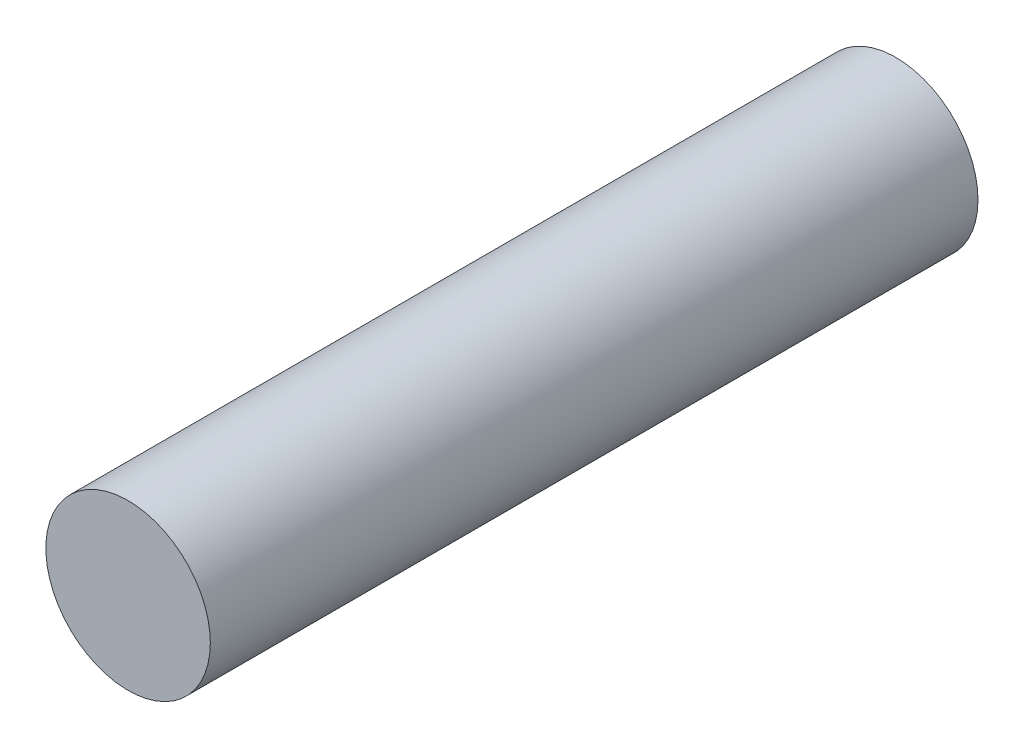
ISO-10303-21;
HEADER;
FILE_DESCRIPTION(('STEP AP214'),'2;1');
FILE_NAME('part.step','',(''),(''),'','','');
FILE_SCHEMA(('AUTOMOTIVE_DESIGN { 1 0 10303 214 1 1 1 1 }'));
ENDSEC;
DATA;
#1=APPLICATION_CONTEXT('core data for automotive mechanical design processes');
#2=APPLICATION_PROTOCOL_DEFINITION('international standard','automotive_design',2000,#1);
#3=PRODUCT_CONTEXT('',#1,'mechanical');
#4=PRODUCT('Part','Part','',(#3));
#5=PRODUCT_RELATED_PRODUCT_CATEGORY('part','',(#4));
#6=PRODUCT_DEFINITION_FORMATION('','',#4);
#7=PRODUCT_DEFINITION_CONTEXT('part definition',#1,'design');
#8=PRODUCT_DEFINITION('design','',#6,#7);
#9=PRODUCT_DEFINITION_SHAPE('','',#8);
#10=(LENGTH_UNIT() NAMED_UNIT(*) SI_UNIT(.MILLI.,.METRE.));
#11=(NAMED_UNIT(*) PLANE_ANGLE_UNIT() SI_UNIT($,.RADIAN.));
#12=(NAMED_UNIT(*) SI_UNIT($,.STERADIAN.) SOLID_ANGLE_UNIT());
#13=UNCERTAINTY_MEASURE_WITH_UNIT(LENGTH_MEASURE(1.E-05),#10,'distance_accuracy_value','');
#14=(GEOMETRIC_REPRESENTATION_CONTEXT(3) GLOBAL_UNCERTAINTY_ASSIGNED_CONTEXT((#13)) GLOBAL_UNIT_ASSIGNED_CONTEXT((#10,
#11,#12)) REPRESENTATION_CONTEXT('',''));
#15=CARTESIAN_POINT('',(0.,0.,0.));
#16=DIRECTION('',(0.,0.,1.));
#17=DIRECTION('',(1.,0.,0.));
#18=AXIS2_PLACEMENT_3D('',#15,#16,#17);
#19=CARTESIAN_POINT('',(0.,0.,28.));
#20=DIRECTION('',(0.,0.,-1.));
#21=DIRECTION('',(-1.,0.,0.));
#22=AXIS2_PLACEMENT_3D('',#19,#20,#21);
#23=CYLINDRICAL_SURFACE('',#22,3.);
#24=CARTESIAN_POINT('',(0.,0.,28.));
#25=DIRECTION('',(0.,0.,1.));
#26=DIRECTION('',(1.,0.,0.));
#27=AXIS2_PLACEMENT_3D('',#24,#25,#26);
#28=CIRCLE('',#27,3.);
#29=CARTESIAN_POINT('',(3.,0.,28.));
#30=VERTEX_POINT('',#29);
#31=EDGE_CURVE('E10',#30,#30,#28,.T.);
#32=ORIENTED_EDGE('',*,*,#31,.F.);
#33=EDGE_LOOP('',(#32));
#34=FACE_BOUND('',#33,.T.);
#35=CARTESIAN_POINT('',(0.,0.,0.));
#36=DIRECTION('',(0.,0.,1.));
#37=DIRECTION('',(1.,0.,0.));
#38=AXIS2_PLACEMENT_3D('',#35,#36,#37);
#39=CIRCLE('',#38,3.);
#40=CARTESIAN_POINT('',(3.,0.,0.));
#41=VERTEX_POINT('',#40);
#42=EDGE_CURVE('E37',#41,#41,#39,.T.);
#43=ORIENTED_EDGE('',*,*,#42,.T.);
#44=EDGE_LOOP('',(#43));
#45=FACE_BOUND('',#44,.T.);
#46=ADVANCED_FACE('F34',(#34,#45),#23,.T.);
#47=CARTESIAN_POINT('',(0.,0.,28.));
#48=DIRECTION('',(0.,0.,1.));
#49=DIRECTION('',(1.,0.,0.));
#50=AXIS2_PLACEMENT_3D('',#47,#48,#49);
#51=PLANE('',#50);
#52=ORIENTED_EDGE('',*,*,#31,.T.);
#53=EDGE_LOOP('',(#52));
#54=FACE_BOUND('',#53,.T.);
#55=ADVANCED_FACE('F49',(#54),#51,.T.);
#56=CARTESIAN_POINT('',(0.,0.,0.));
#57=DIRECTION('',(0.,0.,1.));
#58=DIRECTION('',(1.,0.,0.));
#59=AXIS2_PLACEMENT_3D('',#56,#57,#58);
#60=PLANE('',#59);
#61=ORIENTED_EDGE('',*,*,#42,.F.);
#62=EDGE_LOOP('',(#61));
#63=FACE_BOUND('',#62,.T.);
#64=ADVANCED_FACE('F47',(#63),#60,.F.);
#65=CLOSED_SHELL('',(#46,#55,#64));
#66=MANIFOLD_SOLID_BREP('B2',#65);
#67=ADVANCED_BREP_SHAPE_REPRESENTATION('',(#18,#66),#14);
#68=SHAPE_DEFINITION_REPRESENTATION(#9,#67);
ENDSEC;
END-ISO-10303-21;
